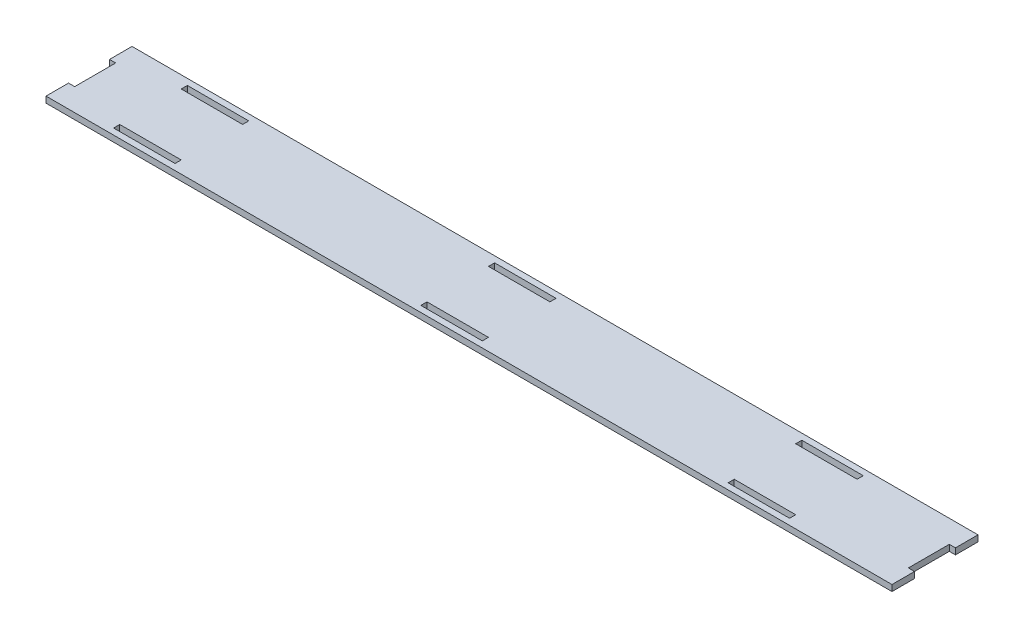
ISO-10303-21;
HEADER;
FILE_DESCRIPTION(('STEP AP214'),'2;1');
FILE_NAME('part.step','',(''),(''),'','','');
FILE_SCHEMA(('AUTOMOTIVE_DESIGN { 1 0 10303 214 1 1 1 1 }'));
ENDSEC;
DATA;
#1=APPLICATION_CONTEXT('core data for automotive mechanical design processes');
#2=APPLICATION_PROTOCOL_DEFINITION('international standard','automotive_design',2000,#1);
#3=PRODUCT_CONTEXT('',#1,'mechanical');
#4=PRODUCT('Part','Part','',(#3));
#5=PRODUCT_RELATED_PRODUCT_CATEGORY('part','',(#4));
#6=PRODUCT_DEFINITION_FORMATION('','',#4);
#7=PRODUCT_DEFINITION_CONTEXT('part definition',#1,'design');
#8=PRODUCT_DEFINITION('design','',#6,#7);
#9=PRODUCT_DEFINITION_SHAPE('','',#8);
#10=(LENGTH_UNIT() NAMED_UNIT(*) SI_UNIT(.MILLI.,.METRE.));
#11=(NAMED_UNIT(*) PLANE_ANGLE_UNIT() SI_UNIT($,.RADIAN.));
#12=(NAMED_UNIT(*) SI_UNIT($,.STERADIAN.) SOLID_ANGLE_UNIT());
#13=UNCERTAINTY_MEASURE_WITH_UNIT(LENGTH_MEASURE(1.E-05),#10,'distance_accuracy_value','');
#14=(GEOMETRIC_REPRESENTATION_CONTEXT(3) GLOBAL_UNCERTAINTY_ASSIGNED_CONTEXT((#13)) GLOBAL_UNIT_ASSIGNED_CONTEXT((#10,
#11,#12)) REPRESENTATION_CONTEXT('',''));
#15=CARTESIAN_POINT('',(0.,0.,0.));
#16=DIRECTION('',(0.,0.,1.));
#17=DIRECTION('',(1.,0.,0.));
#18=AXIS2_PLACEMENT_3D('',#15,#16,#17);
#19=CARTESIAN_POINT('',(0.,3.,0.));
#20=DIRECTION('',(0.,-1.,0.));
#21=DIRECTION('',(0.,0.,-1.));
#22=AXIS2_PLACEMENT_3D('',#19,#20,#21);
#23=PLANE('',#22);
#24=DIRECTION('',(1.,0.,0.));
#25=VECTOR('',#24,1.);
#26=CARTESIAN_POINT('',(180.,3.,-3.00000000000003));
#27=LINE('',#26,#25);
#28=CARTESIAN_POINT('',(180.,3.,-3.00000000000003));
#29=VERTEX_POINT('',#28);
#30=CARTESIAN_POINT('',(210.,3.,-3.));
#31=VERTEX_POINT('',#30);
#32=EDGE_CURVE('E302',#29,#31,#27,.T.);
#33=ORIENTED_EDGE('',*,*,#32,.F.);
#34=DIRECTION('',(0.,0.,1.));
#35=VECTOR('',#34,1.);
#36=CARTESIAN_POINT('',(180.,3.,-3.00000000000003));
#37=LINE('',#36,#35);
#38=CARTESIAN_POINT('',(180.,3.,-6.));
#39=VERTEX_POINT('',#38);
#40=EDGE_CURVE('E310',#39,#29,#37,.T.);
#41=ORIENTED_EDGE('',*,*,#40,.F.);
#42=DIRECTION('',(-1.,0.,0.));
#43=VECTOR('',#42,1.);
#44=CARTESIAN_POINT('',(180.,3.,-6.));
#45=LINE('',#44,#43);
#46=CARTESIAN_POINT('',(210.,3.,-6.00000000000001));
#47=VERTEX_POINT('',#46);
#48=EDGE_CURVE('E307',#47,#39,#45,.T.);
#49=ORIENTED_EDGE('',*,*,#48,.F.);
#50=DIRECTION('',(0.,0.,-1.));
#51=VECTOR('',#50,1.);
#52=CARTESIAN_POINT('',(210.,3.,-3.));
#53=LINE('',#52,#51);
#54=EDGE_CURVE('E304',#31,#47,#53,.T.);
#55=ORIENTED_EDGE('',*,*,#54,.F.);
#56=EDGE_LOOP('',(#33,#41,#49,#55));
#57=FACE_BOUND('',#56,.T.);
#58=DIRECTION('',(0.,0.,1.));
#59=VECTOR('',#58,1.);
#60=CARTESIAN_POINT('',(330.,3.,-39.));
#61=LINE('',#60,#59);
#62=CARTESIAN_POINT('',(330.,3.,-39.));
#63=VERTEX_POINT('',#62);
#64=CARTESIAN_POINT('',(330.,3.,-36.0000000000001));
#65=VERTEX_POINT('',#64);
#66=EDGE_CURVE('E364',#63,#65,#61,.T.);
#67=ORIENTED_EDGE('',*,*,#66,.F.);
#68=DIRECTION('',(-1.,0.,0.));
#69=VECTOR('',#68,1.);
#70=CARTESIAN_POINT('',(330.,3.,-39.));
#71=LINE('',#70,#69);
#72=CARTESIAN_POINT('',(360.,3.,-39.));
#73=VERTEX_POINT('',#72);
#74=EDGE_CURVE('E372',#73,#63,#71,.T.);
#75=ORIENTED_EDGE('',*,*,#74,.F.);
#76=DIRECTION('',(0.,0.,-1.));
#77=VECTOR('',#76,1.);
#78=CARTESIAN_POINT('',(360.,3.,-39.));
#79=LINE('',#78,#77);
#80=CARTESIAN_POINT('',(360.,3.,-36.0000000000001));
#81=VERTEX_POINT('',#80);
#82=EDGE_CURVE('E369',#81,#73,#79,.T.);
#83=ORIENTED_EDGE('',*,*,#82,.F.);
#84=DIRECTION('',(1.,0.,0.));
#85=VECTOR('',#84,1.);
#86=CARTESIAN_POINT('',(330.,3.,-36.0000000000001));
#87=LINE('',#86,#85);
#88=EDGE_CURVE('E366',#65,#81,#87,.T.);
#89=ORIENTED_EDGE('',*,*,#88,.F.);
#90=EDGE_LOOP('',(#67,#75,#83,#89));
#91=FACE_BOUND('',#90,.T.);
#92=DIRECTION('',(0.,0.,1.));
#93=VECTOR('',#92,1.);
#94=CARTESIAN_POINT('',(30.0000000000001,3.,-39.));
#95=LINE('',#94,#93);
#96=CARTESIAN_POINT('',(30.0000000000001,3.,-39.));
#97=VERTEX_POINT('',#96);
#98=CARTESIAN_POINT('',(30.0000000000001,3.,-36.));
#99=VERTEX_POINT('',#98);
#100=EDGE_CURVE('E426',#97,#99,#95,.T.);
#101=ORIENTED_EDGE('',*,*,#100,.F.);
#102=DIRECTION('',(-1.,0.,0.));
#103=VECTOR('',#102,1.);
#104=CARTESIAN_POINT('',(30.0000000000001,3.,-39.));
#105=LINE('',#104,#103);
#106=CARTESIAN_POINT('',(60.0000000000001,3.,-39.));
#107=VERTEX_POINT('',#106);
#108=EDGE_CURVE('E434',#107,#97,#105,.T.);
#109=ORIENTED_EDGE('',*,*,#108,.F.);
#110=DIRECTION('',(0.,0.,-1.));
#111=VECTOR('',#110,1.);
#112=CARTESIAN_POINT('',(60.0000000000001,3.,-39.));
#113=LINE('',#112,#111);
#114=CARTESIAN_POINT('',(60.,3.,-36.));
#115=VERTEX_POINT('',#114);
#116=EDGE_CURVE('E431',#115,#107,#113,.T.);
#117=ORIENTED_EDGE('',*,*,#116,.F.);
#118=DIRECTION('',(1.,0.,0.));
#119=VECTOR('',#118,1.);
#120=CARTESIAN_POINT('',(30.0000000000001,3.,-36.));
#121=LINE('',#120,#119);
#122=EDGE_CURVE('E428',#99,#115,#121,.T.);
#123=ORIENTED_EDGE('',*,*,#122,.F.);
#124=EDGE_LOOP('',(#101,#109,#117,#123));
#125=FACE_BOUND('',#124,.T.);
#126=DIRECTION('',(0.,0.,1.));
#127=VECTOR('',#126,1.);
#128=CARTESIAN_POINT('',(0.,3.,0.));
#129=LINE('',#128,#127);
#130=CARTESIAN_POINT('',(0.,3.,-11.));
#131=VERTEX_POINT('',#130);
#132=CARTESIAN_POINT('',(0.,3.,0.));
#133=VERTEX_POINT('',#132);
#134=EDGE_CURVE('E457',#131,#133,#129,.T.);
#135=ORIENTED_EDGE('',*,*,#134,.T.);
#136=DIRECTION('',(1.,0.,0.));
#137=VECTOR('',#136,1.);
#138=CARTESIAN_POINT('',(0.,3.,0.));
#139=LINE('',#138,#137);
#140=CARTESIAN_POINT('',(413.,3.,0.));
#141=VERTEX_POINT('',#140);
#142=EDGE_CURVE('E460',#133,#141,#139,.T.);
#143=ORIENTED_EDGE('',*,*,#142,.T.);
#144=DIRECTION('',(0.,0.,-1.));
#145=VECTOR('',#144,1.);
#146=CARTESIAN_POINT('',(413.,3.,0.));
#147=LINE('',#146,#145);
#148=CARTESIAN_POINT('',(413.,3.,-11.));
#149=VERTEX_POINT('',#148);
#150=EDGE_CURVE('E463',#141,#149,#147,.T.);
#151=ORIENTED_EDGE('',*,*,#150,.T.);
#152=DIRECTION('',(-1.,0.,0.));
#153=VECTOR('',#152,1.);
#154=CARTESIAN_POINT('',(413.,3.,-11.));
#155=LINE('',#154,#153);
#156=CARTESIAN_POINT('',(410.,3.,-11.));
#157=VERTEX_POINT('',#156);
#158=EDGE_CURVE('E465',#149,#157,#155,.T.);
#159=ORIENTED_EDGE('',*,*,#158,.T.);
#160=DIRECTION('',(0.,0.,-1.));
#161=VECTOR('',#160,1.);
#162=CARTESIAN_POINT('',(410.,3.,-31.));
#163=LINE('',#162,#161);
#164=CARTESIAN_POINT('',(410.,3.,-31.));
#165=VERTEX_POINT('',#164);
#166=EDGE_CURVE('E467',#157,#165,#163,.T.);
#167=ORIENTED_EDGE('',*,*,#166,.T.);
#168=DIRECTION('',(1.,0.,0.));
#169=VECTOR('',#168,1.);
#170=CARTESIAN_POINT('',(413.,3.,-31.));
#171=LINE('',#170,#169);
#172=CARTESIAN_POINT('',(413.,3.,-31.));
#173=VERTEX_POINT('',#172);
#174=EDGE_CURVE('E469',#165,#173,#171,.T.);
#175=ORIENTED_EDGE('',*,*,#174,.T.);
#176=DIRECTION('',(0.,0.,-1.));
#177=VECTOR('',#176,1.);
#178=CARTESIAN_POINT('',(413.,3.,-31.));
#179=LINE('',#178,#177);
#180=CARTESIAN_POINT('',(413.,3.,-42.));
#181=VERTEX_POINT('',#180);
#182=EDGE_CURVE('E471',#173,#181,#179,.T.);
#183=ORIENTED_EDGE('',*,*,#182,.T.);
#184=DIRECTION('',(-1.,0.,0.));
#185=VECTOR('',#184,1.);
#186=CARTESIAN_POINT('',(0.,3.,-42.));
#187=LINE('',#186,#185);
#188=CARTESIAN_POINT('',(0.,3.,-42.));
#189=VERTEX_POINT('',#188);
#190=EDGE_CURVE('E473',#181,#189,#187,.T.);
#191=ORIENTED_EDGE('',*,*,#190,.T.);
#192=DIRECTION('',(0.,0.,1.));
#193=VECTOR('',#192,1.);
#194=CARTESIAN_POINT('',(0.,3.,-31.));
#195=LINE('',#194,#193);
#196=CARTESIAN_POINT('',(0.,3.,-31.));
#197=VERTEX_POINT('',#196);
#198=EDGE_CURVE('E475',#189,#197,#195,.T.);
#199=ORIENTED_EDGE('',*,*,#198,.T.);
#200=DIRECTION('',(1.,0.,0.));
#201=VECTOR('',#200,1.);
#202=CARTESIAN_POINT('',(0.,3.,-31.));
#203=LINE('',#202,#201);
#204=CARTESIAN_POINT('',(3.,3.,-31.));
#205=VERTEX_POINT('',#204);
#206=EDGE_CURVE('E477',#197,#205,#203,.T.);
#207=ORIENTED_EDGE('',*,*,#206,.T.);
#208=DIRECTION('',(0.,0.,1.));
#209=VECTOR('',#208,1.);
#210=CARTESIAN_POINT('',(3.,3.,-31.));
#211=LINE('',#210,#209);
#212=CARTESIAN_POINT('',(3.,3.,-11.));
#213=VERTEX_POINT('',#212);
#214=EDGE_CURVE('E479',#205,#213,#211,.T.);
#215=ORIENTED_EDGE('',*,*,#214,.T.);
#216=DIRECTION('',(-1.,0.,0.));
#217=VECTOR('',#216,1.);
#218=CARTESIAN_POINT('',(0.,3.,-11.));
#219=LINE('',#218,#217);
#220=EDGE_CURVE('E481',#213,#131,#219,.T.);
#221=ORIENTED_EDGE('',*,*,#220,.T.);
#222=EDGE_LOOP('',(#135,#143,#151,#159,#167,#175,#183,#191,#199,#207,#215,#221));
#223=FACE_BOUND('',#222,.T.);
#224=DIRECTION('',(0.,0.,1.));
#225=VECTOR('',#224,1.);
#226=CARTESIAN_POINT('',(180.,3.,-39.));
#227=LINE('',#226,#225);
#228=CARTESIAN_POINT('',(180.,3.,-39.));
#229=VERTEX_POINT('',#228);
#230=CARTESIAN_POINT('',(180.,3.,-36.));
#231=VERTEX_POINT('',#230);
#232=EDGE_CURVE('E395',#229,#231,#227,.T.);
#233=ORIENTED_EDGE('',*,*,#232,.F.);
#234=DIRECTION('',(-1.,0.,0.));
#235=VECTOR('',#234,1.);
#236=CARTESIAN_POINT('',(180.,3.,-39.));
#237=LINE('',#236,#235);
#238=CARTESIAN_POINT('',(210.,3.,-39.));
#239=VERTEX_POINT('',#238);
#240=EDGE_CURVE('E403',#239,#229,#237,.T.);
#241=ORIENTED_EDGE('',*,*,#240,.F.);
#242=DIRECTION('',(0.,0.,-1.));
#243=VECTOR('',#242,1.);
#244=CARTESIAN_POINT('',(210.,3.,-39.));
#245=LINE('',#244,#243);
#246=CARTESIAN_POINT('',(210.,3.,-36.));
#247=VERTEX_POINT('',#246);
#248=EDGE_CURVE('E400',#247,#239,#245,.T.);
#249=ORIENTED_EDGE('',*,*,#248,.F.);
#250=DIRECTION('',(1.,0.,0.));
#251=VECTOR('',#250,1.);
#252=CARTESIAN_POINT('',(180.,3.,-36.));
#253=LINE('',#252,#251);
#254=EDGE_CURVE('E397',#231,#247,#253,.T.);
#255=ORIENTED_EDGE('',*,*,#254,.F.);
#256=EDGE_LOOP('',(#233,#241,#249,#255));
#257=FACE_BOUND('',#256,.T.);
#258=DIRECTION('',(1.,0.,0.));
#259=VECTOR('',#258,1.);
#260=CARTESIAN_POINT('',(330.,3.,-3.00000000000002));
#261=LINE('',#260,#259);
#262=CARTESIAN_POINT('',(330.,3.,-3.00000000000002));
#263=VERTEX_POINT('',#262);
#264=CARTESIAN_POINT('',(360.,3.,-3.00000000000002));
#265=VERTEX_POINT('',#264);
#266=EDGE_CURVE('E333',#263,#265,#261,.T.);
#267=ORIENTED_EDGE('',*,*,#266,.F.);
#268=DIRECTION('',(0.,0.,1.));
#269=VECTOR('',#268,1.);
#270=CARTESIAN_POINT('',(330.,3.,-3.00000000000002));
#271=LINE('',#270,#269);
#272=CARTESIAN_POINT('',(330.,3.,-5.99999999999993));
#273=VERTEX_POINT('',#272);
#274=EDGE_CURVE('E341',#273,#263,#271,.T.);
#275=ORIENTED_EDGE('',*,*,#274,.F.);
#276=DIRECTION('',(-1.,0.,0.));
#277=VECTOR('',#276,1.);
#278=CARTESIAN_POINT('',(330.,3.,-5.99999999999993));
#279=LINE('',#278,#277);
#280=CARTESIAN_POINT('',(360.,3.,-5.99999999999992));
#281=VERTEX_POINT('',#280);
#282=EDGE_CURVE('E338',#281,#273,#279,.T.);
#283=ORIENTED_EDGE('',*,*,#282,.F.);
#284=DIRECTION('',(0.,0.,-1.));
#285=VECTOR('',#284,1.);
#286=CARTESIAN_POINT('',(360.,3.,-3.00000000000002));
#287=LINE('',#286,#285);
#288=EDGE_CURVE('E335',#265,#281,#287,.T.);
#289=ORIENTED_EDGE('',*,*,#288,.F.);
#290=EDGE_LOOP('',(#267,#275,#283,#289));
#291=FACE_BOUND('',#290,.T.);
#292=DIRECTION('',(1.,0.,0.));
#293=VECTOR('',#292,1.);
#294=CARTESIAN_POINT('',(30.0000000000001,3.,-3.00000000000002));
#295=LINE('',#294,#293);
#296=CARTESIAN_POINT('',(30.0000000000001,3.,-3.00000000000002));
#297=VERTEX_POINT('',#296);
#298=CARTESIAN_POINT('',(60.0000000000001,3.,-3.00000000000002));
#299=VERTEX_POINT('',#298);
#300=EDGE_CURVE('E266',#297,#299,#295,.T.);
#301=ORIENTED_EDGE('',*,*,#300,.F.);
#302=DIRECTION('',(0.,0.,1.));
#303=VECTOR('',#302,1.);
#304=CARTESIAN_POINT('',(30.0000000000001,3.,-3.00000000000002));
#305=LINE('',#304,#303);
#306=CARTESIAN_POINT('',(30.0000000000001,3.,-6.00000000000004));
#307=VERTEX_POINT('',#306);
#308=EDGE_CURVE('E288',#307,#297,#305,.T.);
#309=ORIENTED_EDGE('',*,*,#308,.F.);
#310=DIRECTION('',(-1.,0.,0.));
#311=VECTOR('',#310,1.);
#312=CARTESIAN_POINT('',(30.0000000000001,3.,-6.00000000000004));
#313=LINE('',#312,#311);
#314=CARTESIAN_POINT('',(60.,3.,-6.00000000000003));
#315=VERTEX_POINT('',#314);
#316=EDGE_CURVE('E286',#315,#307,#313,.T.);
#317=ORIENTED_EDGE('',*,*,#316,.F.);
#318=DIRECTION('',(0.,0.,-1.));
#319=VECTOR('',#318,1.);
#320=CARTESIAN_POINT('',(60.0000000000001,3.,-3.00000000000002));
#321=LINE('',#320,#319);
#322=EDGE_CURVE('E274',#299,#315,#321,.T.);
#323=ORIENTED_EDGE('',*,*,#322,.F.);
#324=EDGE_LOOP('',(#301,#309,#317,#323));
#325=FACE_BOUND('',#324,.T.);
#326=ADVANCED_FACE('F33',(#57,#91,#125,#223,#257,#291,#325),#23,.F.);
#327=CARTESIAN_POINT('',(0.,0.,0.));
#328=DIRECTION('',(0.,-1.,0.));
#329=DIRECTION('',(0.,0.,-1.));
#330=AXIS2_PLACEMENT_3D('',#327,#328,#329);
#331=PLANE('',#330);
#332=DIRECTION('',(0.,0.,1.));
#333=VECTOR('',#332,1.);
#334=CARTESIAN_POINT('',(0.,0.,0.));
#335=LINE('',#334,#333);
#336=CARTESIAN_POINT('',(0.,0.,-11.));
#337=VERTEX_POINT('',#336);
#338=CARTESIAN_POINT('',(0.,0.,0.));
#339=VERTEX_POINT('',#338);
#340=EDGE_CURVE('E456',#337,#339,#335,.T.);
#341=ORIENTED_EDGE('',*,*,#340,.F.);
#342=DIRECTION('',(-1.,0.,0.));
#343=VECTOR('',#342,1.);
#344=CARTESIAN_POINT('',(0.,0.,-11.));
#345=LINE('',#344,#343);
#346=CARTESIAN_POINT('',(3.,0.,-11.));
#347=VERTEX_POINT('',#346);
#348=EDGE_CURVE('E461',#347,#337,#345,.T.);
#349=ORIENTED_EDGE('',*,*,#348,.F.);
#350=DIRECTION('',(0.,0.,1.));
#351=VECTOR('',#350,1.);
#352=CARTESIAN_POINT('',(3.,0.,-31.));
#353=LINE('',#352,#351);
#354=CARTESIAN_POINT('',(3.,0.,-31.));
#355=VERTEX_POINT('',#354);
#356=EDGE_CURVE('E504',#355,#347,#353,.T.);
#357=ORIENTED_EDGE('',*,*,#356,.F.);
#358=DIRECTION('',(1.,0.,0.));
#359=VECTOR('',#358,1.);
#360=CARTESIAN_POINT('',(0.,0.,-31.));
#361=LINE('',#360,#359);
#362=CARTESIAN_POINT('',(0.,0.,-31.));
#363=VERTEX_POINT('',#362);
#364=EDGE_CURVE('E502',#363,#355,#361,.T.);
#365=ORIENTED_EDGE('',*,*,#364,.F.);
#366=DIRECTION('',(0.,0.,1.));
#367=VECTOR('',#366,1.);
#368=CARTESIAN_POINT('',(0.,0.,-31.));
#369=LINE('',#368,#367);
#370=CARTESIAN_POINT('',(0.,0.,-42.));
#371=VERTEX_POINT('',#370);
#372=EDGE_CURVE('E500',#371,#363,#369,.T.);
#373=ORIENTED_EDGE('',*,*,#372,.F.);
#374=DIRECTION('',(-1.,0.,0.));
#375=VECTOR('',#374,1.);
#376=CARTESIAN_POINT('',(0.,0.,-42.));
#377=LINE('',#376,#375);
#378=CARTESIAN_POINT('',(413.,0.,-42.));
#379=VERTEX_POINT('',#378);
#380=EDGE_CURVE('E498',#379,#371,#377,.T.);
#381=ORIENTED_EDGE('',*,*,#380,.F.);
#382=DIRECTION('',(0.,0.,-1.));
#383=VECTOR('',#382,1.);
#384=CARTESIAN_POINT('',(413.,0.,-31.));
#385=LINE('',#384,#383);
#386=CARTESIAN_POINT('',(413.,0.,-31.));
#387=VERTEX_POINT('',#386);
#388=EDGE_CURVE('E496',#387,#379,#385,.T.);
#389=ORIENTED_EDGE('',*,*,#388,.F.);
#390=DIRECTION('',(1.,0.,0.));
#391=VECTOR('',#390,1.);
#392=CARTESIAN_POINT('',(413.,0.,-31.));
#393=LINE('',#392,#391);
#394=CARTESIAN_POINT('',(410.,0.,-31.));
#395=VERTEX_POINT('',#394);
#396=EDGE_CURVE('E494',#395,#387,#393,.T.);
#397=ORIENTED_EDGE('',*,*,#396,.F.);
#398=DIRECTION('',(0.,0.,-1.));
#399=VECTOR('',#398,1.);
#400=CARTESIAN_POINT('',(410.,0.,-31.));
#401=LINE('',#400,#399);
#402=CARTESIAN_POINT('',(410.,0.,-11.));
#403=VERTEX_POINT('',#402);
#404=EDGE_CURVE('E492',#403,#395,#401,.T.);
#405=ORIENTED_EDGE('',*,*,#404,.F.);
#406=DIRECTION('',(-1.,0.,0.));
#407=VECTOR('',#406,1.);
#408=CARTESIAN_POINT('',(413.,0.,-11.));
#409=LINE('',#408,#407);
#410=CARTESIAN_POINT('',(413.,0.,-11.));
#411=VERTEX_POINT('',#410);
#412=EDGE_CURVE('E490',#411,#403,#409,.T.);
#413=ORIENTED_EDGE('',*,*,#412,.F.);
#414=DIRECTION('',(0.,0.,-1.));
#415=VECTOR('',#414,1.);
#416=CARTESIAN_POINT('',(413.,0.,0.));
#417=LINE('',#416,#415);
#418=CARTESIAN_POINT('',(413.,0.,0.));
#419=VERTEX_POINT('',#418);
#420=EDGE_CURVE('E488',#419,#411,#417,.T.);
#421=ORIENTED_EDGE('',*,*,#420,.F.);
#422=DIRECTION('',(1.,0.,0.));
#423=VECTOR('',#422,1.);
#424=CARTESIAN_POINT('',(0.,0.,0.));
#425=LINE('',#424,#423);
#426=EDGE_CURVE('E486',#339,#419,#425,.T.);
#427=ORIENTED_EDGE('',*,*,#426,.F.);
#428=EDGE_LOOP('',(#341,#349,#357,#365,#373,#381,#389,#397,#405,#413,#421,#427));
#429=FACE_BOUND('',#428,.T.);
#430=DIRECTION('',(-1.,0.,0.));
#431=VECTOR('',#430,1.);
#432=CARTESIAN_POINT('',(30.0000000000001,0.,-39.));
#433=LINE('',#432,#431);
#434=CARTESIAN_POINT('',(60.0000000000001,0.,-39.));
#435=VERTEX_POINT('',#434);
#436=CARTESIAN_POINT('',(30.0000000000001,0.,-39.));
#437=VERTEX_POINT('',#436);
#438=EDGE_CURVE('E429',#435,#437,#433,.T.);
#439=ORIENTED_EDGE('',*,*,#438,.T.);
#440=DIRECTION('',(0.,0.,1.));
#441=VECTOR('',#440,1.);
#442=CARTESIAN_POINT('',(30.0000000000001,0.,-39.));
#443=LINE('',#442,#441);
#444=CARTESIAN_POINT('',(30.0000000000001,0.,-36.));
#445=VERTEX_POINT('',#444);
#446=EDGE_CURVE('E425',#437,#445,#443,.T.);
#447=ORIENTED_EDGE('',*,*,#446,.T.);
#448=DIRECTION('',(1.,0.,0.));
#449=VECTOR('',#448,1.);
#450=CARTESIAN_POINT('',(30.0000000000001,0.,-36.));
#451=LINE('',#450,#449);
#452=CARTESIAN_POINT('',(60.,0.,-36.));
#453=VERTEX_POINT('',#452);
#454=EDGE_CURVE('E439',#445,#453,#451,.T.);
#455=ORIENTED_EDGE('',*,*,#454,.T.);
#456=DIRECTION('',(0.,0.,-1.));
#457=VECTOR('',#456,1.);
#458=CARTESIAN_POINT('',(60.0000000000001,0.,-39.));
#459=LINE('',#458,#457);
#460=EDGE_CURVE('E442',#453,#435,#459,.T.);
#461=ORIENTED_EDGE('',*,*,#460,.T.);
#462=EDGE_LOOP('',(#439,#447,#455,#461));
#463=FACE_BOUND('',#462,.T.);
#464=DIRECTION('',(-1.,0.,0.));
#465=VECTOR('',#464,1.);
#466=CARTESIAN_POINT('',(180.,0.,-39.));
#467=LINE('',#466,#465);
#468=CARTESIAN_POINT('',(210.,0.,-39.));
#469=VERTEX_POINT('',#468);
#470=CARTESIAN_POINT('',(180.,0.,-39.));
#471=VERTEX_POINT('',#470);
#472=EDGE_CURVE('E398',#469,#471,#467,.T.);
#473=ORIENTED_EDGE('',*,*,#472,.T.);
#474=DIRECTION('',(0.,0.,1.));
#475=VECTOR('',#474,1.);
#476=CARTESIAN_POINT('',(180.,0.,-39.));
#477=LINE('',#476,#475);
#478=CARTESIAN_POINT('',(180.,0.,-36.));
#479=VERTEX_POINT('',#478);
#480=EDGE_CURVE('E394',#471,#479,#477,.T.);
#481=ORIENTED_EDGE('',*,*,#480,.T.);
#482=DIRECTION('',(1.,0.,0.));
#483=VECTOR('',#482,1.);
#484=CARTESIAN_POINT('',(180.,0.,-36.));
#485=LINE('',#484,#483);
#486=CARTESIAN_POINT('',(210.,0.,-36.));
#487=VERTEX_POINT('',#486);
#488=EDGE_CURVE('E408',#479,#487,#485,.T.);
#489=ORIENTED_EDGE('',*,*,#488,.T.);
#490=DIRECTION('',(0.,0.,-1.));
#491=VECTOR('',#490,1.);
#492=CARTESIAN_POINT('',(210.,0.,-39.));
#493=LINE('',#492,#491);
#494=EDGE_CURVE('E411',#487,#469,#493,.T.);
#495=ORIENTED_EDGE('',*,*,#494,.T.);
#496=EDGE_LOOP('',(#473,#481,#489,#495));
#497=FACE_BOUND('',#496,.T.);
#498=DIRECTION('',(-1.,0.,0.));
#499=VECTOR('',#498,1.);
#500=CARTESIAN_POINT('',(330.,0.,-39.));
#501=LINE('',#500,#499);
#502=CARTESIAN_POINT('',(360.,0.,-39.));
#503=VERTEX_POINT('',#502);
#504=CARTESIAN_POINT('',(330.,0.,-39.));
#505=VERTEX_POINT('',#504);
#506=EDGE_CURVE('E367',#503,#505,#501,.T.);
#507=ORIENTED_EDGE('',*,*,#506,.T.);
#508=DIRECTION('',(0.,0.,1.));
#509=VECTOR('',#508,1.);
#510=CARTESIAN_POINT('',(330.,0.,-39.));
#511=LINE('',#510,#509);
#512=CARTESIAN_POINT('',(330.,0.,-36.0000000000001));
#513=VERTEX_POINT('',#512);
#514=EDGE_CURVE('E363',#505,#513,#511,.T.);
#515=ORIENTED_EDGE('',*,*,#514,.T.);
#516=DIRECTION('',(1.,0.,0.));
#517=VECTOR('',#516,1.);
#518=CARTESIAN_POINT('',(330.,0.,-36.0000000000001));
#519=LINE('',#518,#517);
#520=CARTESIAN_POINT('',(360.,0.,-36.0000000000001));
#521=VERTEX_POINT('',#520);
#522=EDGE_CURVE('E377',#513,#521,#519,.T.);
#523=ORIENTED_EDGE('',*,*,#522,.T.);
#524=DIRECTION('',(0.,0.,-1.));
#525=VECTOR('',#524,1.);
#526=CARTESIAN_POINT('',(360.,0.,-39.));
#527=LINE('',#526,#525);
#528=EDGE_CURVE('E380',#521,#503,#527,.T.);
#529=ORIENTED_EDGE('',*,*,#528,.T.);
#530=EDGE_LOOP('',(#507,#515,#523,#529));
#531=FACE_BOUND('',#530,.T.);
#532=DIRECTION('',(0.,0.,1.));
#533=VECTOR('',#532,1.);
#534=CARTESIAN_POINT('',(330.,0.,-3.00000000000002));
#535=LINE('',#534,#533);
#536=CARTESIAN_POINT('',(330.,0.,-5.99999999999993));
#537=VERTEX_POINT('',#536);
#538=CARTESIAN_POINT('',(330.,0.,-3.00000000000002));
#539=VERTEX_POINT('',#538);
#540=EDGE_CURVE('E336',#537,#539,#535,.T.);
#541=ORIENTED_EDGE('',*,*,#540,.T.);
#542=DIRECTION('',(1.,0.,0.));
#543=VECTOR('',#542,1.);
#544=CARTESIAN_POINT('',(330.,0.,-3.00000000000002));
#545=LINE('',#544,#543);
#546=CARTESIAN_POINT('',(360.,0.,-3.00000000000002));
#547=VERTEX_POINT('',#546);
#548=EDGE_CURVE('E332',#539,#547,#545,.T.);
#549=ORIENTED_EDGE('',*,*,#548,.T.);
#550=DIRECTION('',(0.,0.,-1.));
#551=VECTOR('',#550,1.);
#552=CARTESIAN_POINT('',(360.,0.,-3.00000000000002));
#553=LINE('',#552,#551);
#554=CARTESIAN_POINT('',(360.,0.,-5.99999999999992));
#555=VERTEX_POINT('',#554);
#556=EDGE_CURVE('E346',#547,#555,#553,.T.);
#557=ORIENTED_EDGE('',*,*,#556,.T.);
#558=DIRECTION('',(-1.,0.,0.));
#559=VECTOR('',#558,1.);
#560=CARTESIAN_POINT('',(330.,0.,-5.99999999999993));
#561=LINE('',#560,#559);
#562=EDGE_CURVE('E349',#555,#537,#561,.T.);
#563=ORIENTED_EDGE('',*,*,#562,.T.);
#564=EDGE_LOOP('',(#541,#549,#557,#563));
#565=FACE_BOUND('',#564,.T.);
#566=DIRECTION('',(0.,0.,1.));
#567=VECTOR('',#566,1.);
#568=CARTESIAN_POINT('',(180.,0.,-3.00000000000003));
#569=LINE('',#568,#567);
#570=CARTESIAN_POINT('',(180.,0.,-6.));
#571=VERTEX_POINT('',#570);
#572=CARTESIAN_POINT('',(180.,0.,-3.00000000000003));
#573=VERTEX_POINT('',#572);
#574=EDGE_CURVE('E305',#571,#573,#569,.T.);
#575=ORIENTED_EDGE('',*,*,#574,.T.);
#576=DIRECTION('',(1.,0.,0.));
#577=VECTOR('',#576,1.);
#578=CARTESIAN_POINT('',(180.,0.,-3.00000000000003));
#579=LINE('',#578,#577);
#580=CARTESIAN_POINT('',(210.,0.,-3.));
#581=VERTEX_POINT('',#580);
#582=EDGE_CURVE('E282',#573,#581,#579,.T.);
#583=ORIENTED_EDGE('',*,*,#582,.T.);
#584=DIRECTION('',(0.,0.,-1.));
#585=VECTOR('',#584,1.);
#586=CARTESIAN_POINT('',(210.,0.,-3.));
#587=LINE('',#586,#585);
#588=CARTESIAN_POINT('',(210.,0.,-6.00000000000001));
#589=VERTEX_POINT('',#588);
#590=EDGE_CURVE('E315',#581,#589,#587,.T.);
#591=ORIENTED_EDGE('',*,*,#590,.T.);
#592=DIRECTION('',(-1.,0.,0.));
#593=VECTOR('',#592,1.);
#594=CARTESIAN_POINT('',(180.,0.,-6.));
#595=LINE('',#594,#593);
#596=EDGE_CURVE('E318',#589,#571,#595,.T.);
#597=ORIENTED_EDGE('',*,*,#596,.T.);
#598=EDGE_LOOP('',(#575,#583,#591,#597));
#599=FACE_BOUND('',#598,.T.);
#600=DIRECTION('',(0.,0.,1.));
#601=VECTOR('',#600,1.);
#602=CARTESIAN_POINT('',(30.0000000000001,0.,-3.00000000000002));
#603=LINE('',#602,#601);
#604=CARTESIAN_POINT('',(30.0000000000001,0.,-6.00000000000004));
#605=VERTEX_POINT('',#604);
#606=CARTESIAN_POINT('',(30.0000000000001,0.,-3.00000000000002));
#607=VERTEX_POINT('',#606);
#608=EDGE_CURVE('E275',#605,#607,#603,.T.);
#609=ORIENTED_EDGE('',*,*,#608,.T.);
#610=DIRECTION('',(1.,0.,0.));
#611=VECTOR('',#610,1.);
#612=CARTESIAN_POINT('',(30.0000000000001,0.,-3.00000000000002));
#613=LINE('',#612,#611);
#614=CARTESIAN_POINT('',(60.0000000000001,0.,-3.00000000000002));
#615=VERTEX_POINT('',#614);
#616=EDGE_CURVE('E56',#607,#615,#613,.T.);
#617=ORIENTED_EDGE('',*,*,#616,.T.);
#618=DIRECTION('',(0.,0.,-1.));
#619=VECTOR('',#618,1.);
#620=CARTESIAN_POINT('',(60.0000000000001,0.,-3.00000000000002));
#621=LINE('',#620,#619);
#622=CARTESIAN_POINT('',(60.,0.,-6.00000000000003));
#623=VERTEX_POINT('',#622);
#624=EDGE_CURVE('E281',#615,#623,#621,.T.);
#625=ORIENTED_EDGE('',*,*,#624,.T.);
#626=DIRECTION('',(-1.,0.,0.));
#627=VECTOR('',#626,1.);
#628=CARTESIAN_POINT('',(30.0000000000001,0.,-6.00000000000004));
#629=LINE('',#628,#627);
#630=EDGE_CURVE('E294',#623,#605,#629,.T.);
#631=ORIENTED_EDGE('',*,*,#630,.T.);
#632=EDGE_LOOP('',(#609,#617,#625,#631));
#633=FACE_BOUND('',#632,.T.);
#634=ADVANCED_FACE('F546',(#429,#463,#497,#531,#565,#599,#633),#331,.T.);
#635=CARTESIAN_POINT('',(0.,3.,0.));
#636=DIRECTION('',(1.,0.,0.));
#637=DIRECTION('',(0.,0.,-1.));
#638=AXIS2_PLACEMENT_3D('',#635,#636,#637);
#639=PLANE('',#638);
#640=ORIENTED_EDGE('',*,*,#340,.T.);
#641=DIRECTION('',(0.,-1.,0.));
#642=VECTOR('',#641,1.);
#643=CARTESIAN_POINT('',(0.,3.,0.));
#644=LINE('',#643,#642);
#645=EDGE_CURVE('E11',#133,#339,#644,.T.);
#646=ORIENTED_EDGE('',*,*,#645,.F.);
#647=ORIENTED_EDGE('',*,*,#134,.F.);
#648=DIRECTION('',(0.,-1.,0.));
#649=VECTOR('',#648,1.);
#650=CARTESIAN_POINT('',(0.,3.,-11.));
#651=LINE('',#650,#649);
#652=EDGE_CURVE('E483',#131,#337,#651,.T.);
#653=ORIENTED_EDGE('',*,*,#652,.T.);
#654=EDGE_LOOP('',(#640,#646,#647,#653));
#655=FACE_BOUND('',#654,.T.);
#656=ADVANCED_FACE('F35',(#655),#639,.F.);
#657=CARTESIAN_POINT('',(0.,3.,0.));
#658=DIRECTION('',(0.,0.,-1.));
#659=DIRECTION('',(-1.,0.,0.));
#660=AXIS2_PLACEMENT_3D('',#657,#658,#659);
#661=PLANE('',#660);
#662=ORIENTED_EDGE('',*,*,#426,.T.);
#663=DIRECTION('',(0.,-1.,0.));
#664=VECTOR('',#663,1.);
#665=CARTESIAN_POINT('',(413.,3.,0.));
#666=LINE('',#665,#664);
#667=EDGE_CURVE('E41',#141,#419,#666,.T.);
#668=ORIENTED_EDGE('',*,*,#667,.F.);
#669=ORIENTED_EDGE('',*,*,#142,.F.);
#670=ORIENTED_EDGE('',*,*,#645,.T.);
#671=EDGE_LOOP('',(#662,#668,#669,#670));
#672=FACE_BOUND('',#671,.T.);
#673=ADVANCED_FACE('F564',(#672),#661,.F.);
#674=CARTESIAN_POINT('',(413.,3.,0.));
#675=DIRECTION('',(-1.,0.,0.));
#676=DIRECTION('',(0.,0.,1.));
#677=AXIS2_PLACEMENT_3D('',#674,#675,#676);
#678=PLANE('',#677);
#679=ORIENTED_EDGE('',*,*,#420,.T.);
#680=DIRECTION('',(0.,-1.,0.));
#681=VECTOR('',#680,1.);
#682=CARTESIAN_POINT('',(413.,3.,-11.));
#683=LINE('',#682,#681);
#684=EDGE_CURVE('E533',#149,#411,#683,.T.);
#685=ORIENTED_EDGE('',*,*,#684,.F.);
#686=ORIENTED_EDGE('',*,*,#150,.F.);
#687=ORIENTED_EDGE('',*,*,#667,.T.);
#688=EDGE_LOOP('',(#679,#685,#686,#687));
#689=FACE_BOUND('',#688,.T.);
#690=ADVANCED_FACE('F540',(#689),#678,.F.);
#691=CARTESIAN_POINT('',(413.,3.,-11.));
#692=DIRECTION('',(0.,0.,1.));
#693=DIRECTION('',(1.,0.,0.));
#694=AXIS2_PLACEMENT_3D('',#691,#692,#693);
#695=PLANE('',#694);
#696=ORIENTED_EDGE('',*,*,#412,.T.);
#697=DIRECTION('',(0.,-1.,0.));
#698=VECTOR('',#697,1.);
#699=CARTESIAN_POINT('',(410.,3.,-11.));
#700=LINE('',#699,#698);
#701=EDGE_CURVE('E530',#157,#403,#700,.T.);
#702=ORIENTED_EDGE('',*,*,#701,.F.);
#703=ORIENTED_EDGE('',*,*,#158,.F.);
#704=ORIENTED_EDGE('',*,*,#684,.T.);
#705=EDGE_LOOP('',(#696,#702,#703,#704));
#706=FACE_BOUND('',#705,.T.);
#707=ADVANCED_FACE('F552',(#706),#695,.F.);
#708=CARTESIAN_POINT('',(410.,3.,-31.));
#709=DIRECTION('',(-1.,0.,0.));
#710=DIRECTION('',(0.,0.,1.));
#711=AXIS2_PLACEMENT_3D('',#708,#709,#710);
#712=PLANE('',#711);
#713=ORIENTED_EDGE('',*,*,#404,.T.);
#714=DIRECTION('',(0.,-1.,0.));
#715=VECTOR('',#714,1.);
#716=CARTESIAN_POINT('',(410.,3.,-31.));
#717=LINE('',#716,#715);
#718=EDGE_CURVE('E527',#165,#395,#717,.T.);
#719=ORIENTED_EDGE('',*,*,#718,.F.);
#720=ORIENTED_EDGE('',*,*,#166,.F.);
#721=ORIENTED_EDGE('',*,*,#701,.T.);
#722=EDGE_LOOP('',(#713,#719,#720,#721));
#723=FACE_BOUND('',#722,.T.);
#724=ADVANCED_FACE('F556',(#723),#712,.F.);
#725=CARTESIAN_POINT('',(413.,3.,-31.));
#726=DIRECTION('',(0.,0.,-1.));
#727=DIRECTION('',(-1.,0.,0.));
#728=AXIS2_PLACEMENT_3D('',#725,#726,#727);
#729=PLANE('',#728);
#730=ORIENTED_EDGE('',*,*,#396,.T.);
#731=DIRECTION('',(0.,-1.,0.));
#732=VECTOR('',#731,1.);
#733=CARTESIAN_POINT('',(413.,3.,-31.));
#734=LINE('',#733,#732);
#735=EDGE_CURVE('E524',#173,#387,#734,.T.);
#736=ORIENTED_EDGE('',*,*,#735,.F.);
#737=ORIENTED_EDGE('',*,*,#174,.F.);
#738=ORIENTED_EDGE('',*,*,#718,.T.);
#739=EDGE_LOOP('',(#730,#736,#737,#738));
#740=FACE_BOUND('',#739,.T.);
#741=ADVANCED_FACE('F597',(#740),#729,.F.);
#742=CARTESIAN_POINT('',(413.,3.,-31.));
#743=DIRECTION('',(-1.,0.,0.));
#744=DIRECTION('',(0.,0.,1.));
#745=AXIS2_PLACEMENT_3D('',#742,#743,#744);
#746=PLANE('',#745);
#747=ORIENTED_EDGE('',*,*,#388,.T.);
#748=DIRECTION('',(0.,-1.,0.));
#749=VECTOR('',#748,1.);
#750=CARTESIAN_POINT('',(413.,3.,-42.));
#751=LINE('',#750,#749);
#752=EDGE_CURVE('E521',#181,#379,#751,.T.);
#753=ORIENTED_EDGE('',*,*,#752,.F.);
#754=ORIENTED_EDGE('',*,*,#182,.F.);
#755=ORIENTED_EDGE('',*,*,#735,.T.);
#756=EDGE_LOOP('',(#747,#753,#754,#755));
#757=FACE_BOUND('',#756,.T.);
#758=ADVANCED_FACE('F595',(#757),#746,.F.);
#759=CARTESIAN_POINT('',(0.,3.,-42.));
#760=DIRECTION('',(0.,0.,1.));
#761=DIRECTION('',(1.,0.,0.));
#762=AXIS2_PLACEMENT_3D('',#759,#760,#761);
#763=PLANE('',#762);
#764=ORIENTED_EDGE('',*,*,#380,.T.);
#765=DIRECTION('',(0.,-1.,0.));
#766=VECTOR('',#765,1.);
#767=CARTESIAN_POINT('',(0.,3.,-42.));
#768=LINE('',#767,#766);
#769=EDGE_CURVE('E518',#189,#371,#768,.T.);
#770=ORIENTED_EDGE('',*,*,#769,.F.);
#771=ORIENTED_EDGE('',*,*,#190,.F.);
#772=ORIENTED_EDGE('',*,*,#752,.T.);
#773=EDGE_LOOP('',(#764,#770,#771,#772));
#774=FACE_BOUND('',#773,.T.);
#775=ADVANCED_FACE('F591',(#774),#763,.F.);
#776=CARTESIAN_POINT('',(0.,3.,-31.));
#777=DIRECTION('',(1.,0.,0.));
#778=DIRECTION('',(0.,0.,-1.));
#779=AXIS2_PLACEMENT_3D('',#776,#777,#778);
#780=PLANE('',#779);
#781=ORIENTED_EDGE('',*,*,#372,.T.);
#782=DIRECTION('',(0.,-1.,0.));
#783=VECTOR('',#782,1.);
#784=CARTESIAN_POINT('',(0.,3.,-31.));
#785=LINE('',#784,#783);
#786=EDGE_CURVE('E515',#197,#363,#785,.T.);
#787=ORIENTED_EDGE('',*,*,#786,.F.);
#788=ORIENTED_EDGE('',*,*,#198,.F.);
#789=ORIENTED_EDGE('',*,*,#769,.T.);
#790=EDGE_LOOP('',(#781,#787,#788,#789));
#791=FACE_BOUND('',#790,.T.);
#792=ADVANCED_FACE('F586',(#791),#780,.F.);
#793=CARTESIAN_POINT('',(0.,3.,-31.));
#794=DIRECTION('',(0.,0.,-1.));
#795=DIRECTION('',(-1.,0.,0.));
#796=AXIS2_PLACEMENT_3D('',#793,#794,#795);
#797=PLANE('',#796);
#798=ORIENTED_EDGE('',*,*,#364,.T.);
#799=DIRECTION('',(0.,-1.,0.));
#800=VECTOR('',#799,1.);
#801=CARTESIAN_POINT('',(3.,3.,-31.));
#802=LINE('',#801,#800);
#803=EDGE_CURVE('E512',#205,#355,#802,.T.);
#804=ORIENTED_EDGE('',*,*,#803,.F.);
#805=ORIENTED_EDGE('',*,*,#206,.F.);
#806=ORIENTED_EDGE('',*,*,#786,.T.);
#807=EDGE_LOOP('',(#798,#804,#805,#806));
#808=FACE_BOUND('',#807,.T.);
#809=ADVANCED_FACE('F580',(#808),#797,.F.);
#810=CARTESIAN_POINT('',(3.,3.,-31.));
#811=DIRECTION('',(1.,0.,0.));
#812=DIRECTION('',(0.,0.,-1.));
#813=AXIS2_PLACEMENT_3D('',#810,#811,#812);
#814=PLANE('',#813);
#815=ORIENTED_EDGE('',*,*,#356,.T.);
#816=DIRECTION('',(0.,-1.,0.));
#817=VECTOR('',#816,1.);
#818=CARTESIAN_POINT('',(3.,3.,-11.));
#819=LINE('',#818,#817);
#820=EDGE_CURVE('E509',#213,#347,#819,.T.);
#821=ORIENTED_EDGE('',*,*,#820,.F.);
#822=ORIENTED_EDGE('',*,*,#214,.F.);
#823=ORIENTED_EDGE('',*,*,#803,.T.);
#824=EDGE_LOOP('',(#815,#821,#822,#823));
#825=FACE_BOUND('',#824,.T.);
#826=ADVANCED_FACE('F576',(#825),#814,.F.);
#827=CARTESIAN_POINT('',(0.,3.,-11.));
#828=DIRECTION('',(0.,0.,1.));
#829=DIRECTION('',(1.,0.,0.));
#830=AXIS2_PLACEMENT_3D('',#827,#828,#829);
#831=PLANE('',#830);
#832=ORIENTED_EDGE('',*,*,#348,.T.);
#833=ORIENTED_EDGE('',*,*,#652,.F.);
#834=ORIENTED_EDGE('',*,*,#220,.F.);
#835=ORIENTED_EDGE('',*,*,#820,.T.);
#836=EDGE_LOOP('',(#832,#833,#834,#835));
#837=FACE_BOUND('',#836,.T.);
#838=ADVANCED_FACE('F571',(#837),#831,.F.);
#839=CARTESIAN_POINT('',(30.0000000000001,3.,-39.));
#840=DIRECTION('',(1.,0.,0.));
#841=DIRECTION('',(0.,0.,-1.));
#842=AXIS2_PLACEMENT_3D('',#839,#840,#841);
#843=PLANE('',#842);
#844=ORIENTED_EDGE('',*,*,#446,.F.);
#845=DIRECTION('',(0.,-1.,0.));
#846=VECTOR('',#845,1.);
#847=CARTESIAN_POINT('',(30.0000000000001,3.,-39.));
#848=LINE('',#847,#846);
#849=EDGE_CURVE('E436',#97,#437,#848,.T.);
#850=ORIENTED_EDGE('',*,*,#849,.F.);
#851=ORIENTED_EDGE('',*,*,#100,.T.);
#852=DIRECTION('',(0.,-1.,0.));
#853=VECTOR('',#852,1.);
#854=CARTESIAN_POINT('',(30.0000000000001,3.,-36.));
#855=LINE('',#854,#853);
#856=EDGE_CURVE('E453',#99,#445,#855,.T.);
#857=ORIENTED_EDGE('',*,*,#856,.T.);
#858=EDGE_LOOP('',(#844,#850,#851,#857));
#859=FACE_BOUND('',#858,.T.);
#860=ADVANCED_FACE('F616',(#859),#843,.T.);
#861=CARTESIAN_POINT('',(30.0000000000001,3.,-36.));
#862=DIRECTION('',(0.,0.,-1.));
#863=DIRECTION('',(-1.,0.,0.));
#864=AXIS2_PLACEMENT_3D('',#861,#862,#863);
#865=PLANE('',#864);
#866=ORIENTED_EDGE('',*,*,#454,.F.);
#867=ORIENTED_EDGE('',*,*,#856,.F.);
#868=ORIENTED_EDGE('',*,*,#122,.T.);
#869=DIRECTION('',(0.,-1.,0.));
#870=VECTOR('',#869,1.);
#871=CARTESIAN_POINT('',(60.,3.,-36.));
#872=LINE('',#871,#870);
#873=EDGE_CURVE('E451',#115,#453,#872,.T.);
#874=ORIENTED_EDGE('',*,*,#873,.T.);
#875=EDGE_LOOP('',(#866,#867,#868,#874));
#876=FACE_BOUND('',#875,.T.);
#877=ADVANCED_FACE('F654',(#876),#865,.T.);
#878=CARTESIAN_POINT('',(60.0000000000001,3.,-39.));
#879=DIRECTION('',(-1.,0.,0.));
#880=DIRECTION('',(0.,0.,1.));
#881=AXIS2_PLACEMENT_3D('',#878,#879,#880);
#882=PLANE('',#881);
#883=ORIENTED_EDGE('',*,*,#460,.F.);
#884=ORIENTED_EDGE('',*,*,#873,.F.);
#885=ORIENTED_EDGE('',*,*,#116,.T.);
#886=DIRECTION('',(0.,-1.,0.));
#887=VECTOR('',#886,1.);
#888=CARTESIAN_POINT('',(60.0000000000001,3.,-39.));
#889=LINE('',#888,#887);
#890=EDGE_CURVE('E449',#107,#435,#889,.T.);
#891=ORIENTED_EDGE('',*,*,#890,.T.);
#892=EDGE_LOOP('',(#883,#884,#885,#891));
#893=FACE_BOUND('',#892,.T.);
#894=ADVANCED_FACE('F661',(#893),#882,.T.);
#895=CARTESIAN_POINT('',(30.0000000000001,3.,-39.));
#896=DIRECTION('',(0.,0.,1.));
#897=DIRECTION('',(1.,0.,0.));
#898=AXIS2_PLACEMENT_3D('',#895,#896,#897);
#899=PLANE('',#898);
#900=ORIENTED_EDGE('',*,*,#438,.F.);
#901=ORIENTED_EDGE('',*,*,#890,.F.);
#902=ORIENTED_EDGE('',*,*,#108,.T.);
#903=ORIENTED_EDGE('',*,*,#849,.T.);
#904=EDGE_LOOP('',(#900,#901,#902,#903));
#905=FACE_BOUND('',#904,.T.);
#906=ADVANCED_FACE('F668',(#905),#899,.T.);
#907=CARTESIAN_POINT('',(180.,3.,-39.));
#908=DIRECTION('',(1.,0.,0.));
#909=DIRECTION('',(0.,0.,-1.));
#910=AXIS2_PLACEMENT_3D('',#907,#908,#909);
#911=PLANE('',#910);
#912=ORIENTED_EDGE('',*,*,#480,.F.);
#913=DIRECTION('',(0.,-1.,0.));
#914=VECTOR('',#913,1.);
#915=CARTESIAN_POINT('',(180.,3.,-39.));
#916=LINE('',#915,#914);
#917=EDGE_CURVE('E405',#229,#471,#916,.T.);
#918=ORIENTED_EDGE('',*,*,#917,.F.);
#919=ORIENTED_EDGE('',*,*,#232,.T.);
#920=DIRECTION('',(0.,-1.,0.));
#921=VECTOR('',#920,1.);
#922=CARTESIAN_POINT('',(180.,3.,-36.));
#923=LINE('',#922,#921);
#924=EDGE_CURVE('E422',#231,#479,#923,.T.);
#925=ORIENTED_EDGE('',*,*,#924,.T.);
#926=EDGE_LOOP('',(#912,#918,#919,#925));
#927=FACE_BOUND('',#926,.T.);
#928=ADVANCED_FACE('F676',(#927),#911,.T.);
#929=CARTESIAN_POINT('',(180.,3.,-36.));
#930=DIRECTION('',(0.,0.,-1.));
#931=DIRECTION('',(-1.,0.,0.));
#932=AXIS2_PLACEMENT_3D('',#929,#930,#931);
#933=PLANE('',#932);
#934=ORIENTED_EDGE('',*,*,#488,.F.);
#935=ORIENTED_EDGE('',*,*,#924,.F.);
#936=ORIENTED_EDGE('',*,*,#254,.T.);
#937=DIRECTION('',(0.,-1.,0.));
#938=VECTOR('',#937,1.);
#939=CARTESIAN_POINT('',(210.,3.,-36.));
#940=LINE('',#939,#938);
#941=EDGE_CURVE('E420',#247,#487,#940,.T.);
#942=ORIENTED_EDGE('',*,*,#941,.T.);
#943=EDGE_LOOP('',(#934,#935,#936,#942));
#944=FACE_BOUND('',#943,.T.);
#945=ADVANCED_FACE('F684',(#944),#933,.T.);
#946=CARTESIAN_POINT('',(210.,3.,-39.));
#947=DIRECTION('',(-1.,0.,0.));
#948=DIRECTION('',(0.,0.,1.));
#949=AXIS2_PLACEMENT_3D('',#946,#947,#948);
#950=PLANE('',#949);
#951=ORIENTED_EDGE('',*,*,#494,.F.);
#952=ORIENTED_EDGE('',*,*,#941,.F.);
#953=ORIENTED_EDGE('',*,*,#248,.T.);
#954=DIRECTION('',(0.,-1.,0.));
#955=VECTOR('',#954,1.);
#956=CARTESIAN_POINT('',(210.,3.,-39.));
#957=LINE('',#956,#955);
#958=EDGE_CURVE('E418',#239,#469,#957,.T.);
#959=ORIENTED_EDGE('',*,*,#958,.T.);
#960=EDGE_LOOP('',(#951,#952,#953,#959));
#961=FACE_BOUND('',#960,.T.);
#962=ADVANCED_FACE('F692',(#961),#950,.T.);
#963=CARTESIAN_POINT('',(180.,3.,-39.));
#964=DIRECTION('',(0.,0.,1.));
#965=DIRECTION('',(1.,0.,0.));
#966=AXIS2_PLACEMENT_3D('',#963,#964,#965);
#967=PLANE('',#966);
#968=ORIENTED_EDGE('',*,*,#472,.F.);
#969=ORIENTED_EDGE('',*,*,#958,.F.);
#970=ORIENTED_EDGE('',*,*,#240,.T.);
#971=ORIENTED_EDGE('',*,*,#917,.T.);
#972=EDGE_LOOP('',(#968,#969,#970,#971));
#973=FACE_BOUND('',#972,.T.);
#974=ADVANCED_FACE('F700',(#973),#967,.T.);
#975=CARTESIAN_POINT('',(330.,3.,-39.));
#976=DIRECTION('',(1.,0.,0.));
#977=DIRECTION('',(0.,0.,-1.));
#978=AXIS2_PLACEMENT_3D('',#975,#976,#977);
#979=PLANE('',#978);
#980=ORIENTED_EDGE('',*,*,#514,.F.);
#981=DIRECTION('',(0.,-1.,0.));
#982=VECTOR('',#981,1.);
#983=CARTESIAN_POINT('',(330.,3.,-39.));
#984=LINE('',#983,#982);
#985=EDGE_CURVE('E374',#63,#505,#984,.T.);
#986=ORIENTED_EDGE('',*,*,#985,.F.);
#987=ORIENTED_EDGE('',*,*,#66,.T.);
#988=DIRECTION('',(0.,-1.,0.));
#989=VECTOR('',#988,1.);
#990=CARTESIAN_POINT('',(330.,3.,-36.0000000000001));
#991=LINE('',#990,#989);
#992=EDGE_CURVE('E391',#65,#513,#991,.T.);
#993=ORIENTED_EDGE('',*,*,#992,.T.);
#994=EDGE_LOOP('',(#980,#986,#987,#993));
#995=FACE_BOUND('',#994,.T.);
#996=ADVANCED_FACE('F708',(#995),#979,.T.);
#997=CARTESIAN_POINT('',(330.,3.,-36.0000000000001));
#998=DIRECTION('',(0.,0.,-1.));
#999=DIRECTION('',(-1.,0.,0.));
#1000=AXIS2_PLACEMENT_3D('',#997,#998,#999);
#1001=PLANE('',#1000);
#1002=ORIENTED_EDGE('',*,*,#522,.F.);
#1003=ORIENTED_EDGE('',*,*,#992,.F.);
#1004=ORIENTED_EDGE('',*,*,#88,.T.);
#1005=DIRECTION('',(0.,-1.,0.));
#1006=VECTOR('',#1005,1.);
#1007=CARTESIAN_POINT('',(360.,3.,-36.0000000000001));
#1008=LINE('',#1007,#1006);
#1009=EDGE_CURVE('E389',#81,#521,#1008,.T.);
#1010=ORIENTED_EDGE('',*,*,#1009,.T.);
#1011=EDGE_LOOP('',(#1002,#1003,#1004,#1010));
#1012=FACE_BOUND('',#1011,.T.);
#1013=ADVANCED_FACE('F716',(#1012),#1001,.T.);
#1014=CARTESIAN_POINT('',(360.,3.,-39.));
#1015=DIRECTION('',(-1.,0.,0.));
#1016=DIRECTION('',(0.,0.,1.));
#1017=AXIS2_PLACEMENT_3D('',#1014,#1015,#1016);
#1018=PLANE('',#1017);
#1019=ORIENTED_EDGE('',*,*,#528,.F.);
#1020=ORIENTED_EDGE('',*,*,#1009,.F.);
#1021=ORIENTED_EDGE('',*,*,#82,.T.);
#1022=DIRECTION('',(0.,-1.,0.));
#1023=VECTOR('',#1022,1.);
#1024=CARTESIAN_POINT('',(360.,3.,-39.));
#1025=LINE('',#1024,#1023);
#1026=EDGE_CURVE('E387',#73,#503,#1025,.T.);
#1027=ORIENTED_EDGE('',*,*,#1026,.T.);
#1028=EDGE_LOOP('',(#1019,#1020,#1021,#1027));
#1029=FACE_BOUND('',#1028,.T.);
#1030=ADVANCED_FACE('F724',(#1029),#1018,.T.);
#1031=CARTESIAN_POINT('',(330.,3.,-39.));
#1032=DIRECTION('',(0.,0.,1.));
#1033=DIRECTION('',(1.,0.,0.));
#1034=AXIS2_PLACEMENT_3D('',#1031,#1032,#1033);
#1035=PLANE('',#1034);
#1036=ORIENTED_EDGE('',*,*,#506,.F.);
#1037=ORIENTED_EDGE('',*,*,#1026,.F.);
#1038=ORIENTED_EDGE('',*,*,#74,.T.);
#1039=ORIENTED_EDGE('',*,*,#985,.T.);
#1040=EDGE_LOOP('',(#1036,#1037,#1038,#1039));
#1041=FACE_BOUND('',#1040,.T.);
#1042=ADVANCED_FACE('F732',(#1041),#1035,.T.);
#1043=CARTESIAN_POINT('',(330.,3.,-3.00000000000002));
#1044=DIRECTION('',(0.,0.,-1.));
#1045=DIRECTION('',(-1.,0.,0.));
#1046=AXIS2_PLACEMENT_3D('',#1043,#1044,#1045);
#1047=PLANE('',#1046);
#1048=ORIENTED_EDGE('',*,*,#548,.F.);
#1049=DIRECTION('',(0.,-1.,0.));
#1050=VECTOR('',#1049,1.);
#1051=CARTESIAN_POINT('',(330.,3.,-3.00000000000002));
#1052=LINE('',#1051,#1050);
#1053=EDGE_CURVE('E343',#263,#539,#1052,.T.);
#1054=ORIENTED_EDGE('',*,*,#1053,.F.);
#1055=ORIENTED_EDGE('',*,*,#266,.T.);
#1056=DIRECTION('',(0.,-1.,0.));
#1057=VECTOR('',#1056,1.);
#1058=CARTESIAN_POINT('',(360.,3.,-3.00000000000002));
#1059=LINE('',#1058,#1057);
#1060=EDGE_CURVE('E360',#265,#547,#1059,.T.);
#1061=ORIENTED_EDGE('',*,*,#1060,.T.);
#1062=EDGE_LOOP('',(#1048,#1054,#1055,#1061));
#1063=FACE_BOUND('',#1062,.T.);
#1064=ADVANCED_FACE('F740',(#1063),#1047,.T.);
#1065=CARTESIAN_POINT('',(360.,3.,-3.00000000000002));
#1066=DIRECTION('',(-1.,0.,0.));
#1067=DIRECTION('',(0.,0.,1.));
#1068=AXIS2_PLACEMENT_3D('',#1065,#1066,#1067);
#1069=PLANE('',#1068);
#1070=ORIENTED_EDGE('',*,*,#556,.F.);
#1071=ORIENTED_EDGE('',*,*,#1060,.F.);
#1072=ORIENTED_EDGE('',*,*,#288,.T.);
#1073=DIRECTION('',(0.,-1.,0.));
#1074=VECTOR('',#1073,1.);
#1075=CARTESIAN_POINT('',(360.,3.,-5.99999999999992));
#1076=LINE('',#1075,#1074);
#1077=EDGE_CURVE('E358',#281,#555,#1076,.T.);
#1078=ORIENTED_EDGE('',*,*,#1077,.T.);
#1079=EDGE_LOOP('',(#1070,#1071,#1072,#1078));
#1080=FACE_BOUND('',#1079,.T.);
#1081=ADVANCED_FACE('F748',(#1080),#1069,.T.);
#1082=CARTESIAN_POINT('',(330.,3.,-5.99999999999993));
#1083=DIRECTION('',(0.,0.,1.));
#1084=DIRECTION('',(1.,0.,0.));
#1085=AXIS2_PLACEMENT_3D('',#1082,#1083,#1084);
#1086=PLANE('',#1085);
#1087=ORIENTED_EDGE('',*,*,#562,.F.);
#1088=ORIENTED_EDGE('',*,*,#1077,.F.);
#1089=ORIENTED_EDGE('',*,*,#282,.T.);
#1090=DIRECTION('',(0.,-1.,0.));
#1091=VECTOR('',#1090,1.);
#1092=CARTESIAN_POINT('',(330.,3.,-5.99999999999993));
#1093=LINE('',#1092,#1091);
#1094=EDGE_CURVE('E356',#273,#537,#1093,.T.);
#1095=ORIENTED_EDGE('',*,*,#1094,.T.);
#1096=EDGE_LOOP('',(#1087,#1088,#1089,#1095));
#1097=FACE_BOUND('',#1096,.T.);
#1098=ADVANCED_FACE('F756',(#1097),#1086,.T.);
#1099=CARTESIAN_POINT('',(330.,3.,-3.00000000000002));
#1100=DIRECTION('',(1.,0.,0.));
#1101=DIRECTION('',(0.,0.,-1.));
#1102=AXIS2_PLACEMENT_3D('',#1099,#1100,#1101);
#1103=PLANE('',#1102);
#1104=ORIENTED_EDGE('',*,*,#540,.F.);
#1105=ORIENTED_EDGE('',*,*,#1094,.F.);
#1106=ORIENTED_EDGE('',*,*,#274,.T.);
#1107=ORIENTED_EDGE('',*,*,#1053,.T.);
#1108=EDGE_LOOP('',(#1104,#1105,#1106,#1107));
#1109=FACE_BOUND('',#1108,.T.);
#1110=ADVANCED_FACE('F764',(#1109),#1103,.T.);
#1111=CARTESIAN_POINT('',(180.,3.,-3.00000000000003));
#1112=DIRECTION('',(0.,0.,-1.));
#1113=DIRECTION('',(-1.,0.,0.));
#1114=AXIS2_PLACEMENT_3D('',#1111,#1112,#1113);
#1115=PLANE('',#1114);
#1116=ORIENTED_EDGE('',*,*,#582,.F.);
#1117=DIRECTION('',(0.,-1.,0.));
#1118=VECTOR('',#1117,1.);
#1119=CARTESIAN_POINT('',(180.,3.,-3.00000000000003));
#1120=LINE('',#1119,#1118);
#1121=EDGE_CURVE('E312',#29,#573,#1120,.T.);
#1122=ORIENTED_EDGE('',*,*,#1121,.F.);
#1123=ORIENTED_EDGE('',*,*,#32,.T.);
#1124=DIRECTION('',(0.,-1.,0.));
#1125=VECTOR('',#1124,1.);
#1126=CARTESIAN_POINT('',(210.,3.,-3.));
#1127=LINE('',#1126,#1125);
#1128=EDGE_CURVE('E329',#31,#581,#1127,.T.);
#1129=ORIENTED_EDGE('',*,*,#1128,.T.);
#1130=EDGE_LOOP('',(#1116,#1122,#1123,#1129));
#1131=FACE_BOUND('',#1130,.T.);
#1132=ADVANCED_FACE('F772',(#1131),#1115,.T.);
#1133=CARTESIAN_POINT('',(210.,3.,-3.));
#1134=DIRECTION('',(-1.,0.,0.));
#1135=DIRECTION('',(0.,0.,1.));
#1136=AXIS2_PLACEMENT_3D('',#1133,#1134,#1135);
#1137=PLANE('',#1136);
#1138=ORIENTED_EDGE('',*,*,#590,.F.);
#1139=ORIENTED_EDGE('',*,*,#1128,.F.);
#1140=ORIENTED_EDGE('',*,*,#54,.T.);
#1141=DIRECTION('',(0.,-1.,0.));
#1142=VECTOR('',#1141,1.);
#1143=CARTESIAN_POINT('',(210.,3.,-6.00000000000001));
#1144=LINE('',#1143,#1142);
#1145=EDGE_CURVE('E327',#47,#589,#1144,.T.);
#1146=ORIENTED_EDGE('',*,*,#1145,.T.);
#1147=EDGE_LOOP('',(#1138,#1139,#1140,#1146));
#1148=FACE_BOUND('',#1147,.T.);
#1149=ADVANCED_FACE('F780',(#1148),#1137,.T.);
#1150=CARTESIAN_POINT('',(180.,3.,-6.));
#1151=DIRECTION('',(0.,0.,1.));
#1152=DIRECTION('',(1.,0.,0.));
#1153=AXIS2_PLACEMENT_3D('',#1150,#1151,#1152);
#1154=PLANE('',#1153);
#1155=ORIENTED_EDGE('',*,*,#596,.F.);
#1156=ORIENTED_EDGE('',*,*,#1145,.F.);
#1157=ORIENTED_EDGE('',*,*,#48,.T.);
#1158=DIRECTION('',(0.,-1.,0.));
#1159=VECTOR('',#1158,1.);
#1160=CARTESIAN_POINT('',(180.,3.,-6.));
#1161=LINE('',#1160,#1159);
#1162=EDGE_CURVE('E325',#39,#571,#1161,.T.);
#1163=ORIENTED_EDGE('',*,*,#1162,.T.);
#1164=EDGE_LOOP('',(#1155,#1156,#1157,#1163));
#1165=FACE_BOUND('',#1164,.T.);
#1166=ADVANCED_FACE('F788',(#1165),#1154,.T.);
#1167=CARTESIAN_POINT('',(180.,3.,-3.00000000000003));
#1168=DIRECTION('',(1.,0.,0.));
#1169=DIRECTION('',(0.,0.,-1.));
#1170=AXIS2_PLACEMENT_3D('',#1167,#1168,#1169);
#1171=PLANE('',#1170);
#1172=ORIENTED_EDGE('',*,*,#574,.F.);
#1173=ORIENTED_EDGE('',*,*,#1162,.F.);
#1174=ORIENTED_EDGE('',*,*,#40,.T.);
#1175=ORIENTED_EDGE('',*,*,#1121,.T.);
#1176=EDGE_LOOP('',(#1172,#1173,#1174,#1175));
#1177=FACE_BOUND('',#1176,.T.);
#1178=ADVANCED_FACE('F796',(#1177),#1171,.T.);
#1179=CARTESIAN_POINT('',(30.0000000000001,3.,-3.00000000000002));
#1180=DIRECTION('',(0.,0.,-1.));
#1181=DIRECTION('',(-1.,0.,0.));
#1182=AXIS2_PLACEMENT_3D('',#1179,#1180,#1181);
#1183=PLANE('',#1182);
#1184=ORIENTED_EDGE('',*,*,#616,.F.);
#1185=DIRECTION('',(0.,-1.,0.));
#1186=VECTOR('',#1185,1.);
#1187=CARTESIAN_POINT('',(30.0000000000001,3.,-3.00000000000002));
#1188=LINE('',#1187,#1186);
#1189=EDGE_CURVE('E270',#297,#607,#1188,.T.);
#1190=ORIENTED_EDGE('',*,*,#1189,.F.);
#1191=ORIENTED_EDGE('',*,*,#300,.T.);
#1192=DIRECTION('',(0.,-1.,0.));
#1193=VECTOR('',#1192,1.);
#1194=CARTESIAN_POINT('',(60.0000000000001,3.,-3.00000000000002));
#1195=LINE('',#1194,#1193);
#1196=EDGE_CURVE('E269',#299,#615,#1195,.T.);
#1197=ORIENTED_EDGE('',*,*,#1196,.T.);
#1198=EDGE_LOOP('',(#1184,#1190,#1191,#1197));
#1199=FACE_BOUND('',#1198,.T.);
#1200=ADVANCED_FACE('F268',(#1199),#1183,.T.);
#1201=CARTESIAN_POINT('',(60.0000000000001,3.,-3.00000000000002));
#1202=DIRECTION('',(-1.,0.,0.));
#1203=DIRECTION('',(0.,0.,1.));
#1204=AXIS2_PLACEMENT_3D('',#1201,#1202,#1203);
#1205=PLANE('',#1204);
#1206=ORIENTED_EDGE('',*,*,#624,.F.);
#1207=ORIENTED_EDGE('',*,*,#1196,.F.);
#1208=ORIENTED_EDGE('',*,*,#322,.T.);
#1209=DIRECTION('',(0.,-1.,0.));
#1210=VECTOR('',#1209,1.);
#1211=CARTESIAN_POINT('',(60.,3.,-6.00000000000003));
#1212=LINE('',#1211,#1210);
#1213=EDGE_CURVE('E283',#315,#623,#1212,.T.);
#1214=ORIENTED_EDGE('',*,*,#1213,.T.);
#1215=EDGE_LOOP('',(#1206,#1207,#1208,#1214));
#1216=FACE_BOUND('',#1215,.T.);
#1217=ADVANCED_FACE('F278',(#1216),#1205,.T.);
#1218=CARTESIAN_POINT('',(30.0000000000001,3.,-6.00000000000004));
#1219=DIRECTION('',(0.,0.,1.));
#1220=DIRECTION('',(1.,0.,0.));
#1221=AXIS2_PLACEMENT_3D('',#1218,#1219,#1220);
#1222=PLANE('',#1221);
#1223=ORIENTED_EDGE('',*,*,#630,.F.);
#1224=ORIENTED_EDGE('',*,*,#1213,.F.);
#1225=ORIENTED_EDGE('',*,*,#316,.T.);
#1226=DIRECTION('',(0.,-1.,0.));
#1227=VECTOR('',#1226,1.);
#1228=CARTESIAN_POINT('',(30.0000000000001,3.,-6.00000000000004));
#1229=LINE('',#1228,#1227);
#1230=EDGE_CURVE('E48',#307,#605,#1229,.T.);
#1231=ORIENTED_EDGE('',*,*,#1230,.T.);
#1232=EDGE_LOOP('',(#1223,#1224,#1225,#1231));
#1233=FACE_BOUND('',#1232,.T.);
#1234=ADVANCED_FACE('F817',(#1233),#1222,.T.);
#1235=CARTESIAN_POINT('',(30.0000000000001,3.,-3.00000000000002));
#1236=DIRECTION('',(1.,0.,0.));
#1237=DIRECTION('',(0.,0.,-1.));
#1238=AXIS2_PLACEMENT_3D('',#1235,#1236,#1237);
#1239=PLANE('',#1238);
#1240=ORIENTED_EDGE('',*,*,#608,.F.);
#1241=ORIENTED_EDGE('',*,*,#1230,.F.);
#1242=ORIENTED_EDGE('',*,*,#308,.T.);
#1243=ORIENTED_EDGE('',*,*,#1189,.T.);
#1244=EDGE_LOOP('',(#1240,#1241,#1242,#1243));
#1245=FACE_BOUND('',#1244,.T.);
#1246=ADVANCED_FACE('F824',(#1245),#1239,.T.);
#1247=CLOSED_SHELL('',(#326,#634,#656,#673,#690,#707,#724,#741,#758,#775,#792,#809,#826,#838,
#860,#877,#894,#906,#928,#945,#962,#974,#996,#1013,#1030,#1042,#1064,#1081,#1098,#1110,#1132,
#1149,#1166,#1178,#1200,#1217,#1234,#1246));
#1248=MANIFOLD_SOLID_BREP('B2',#1247);
#1249=ADVANCED_BREP_SHAPE_REPRESENTATION('',(#18,#1248),#14);
#1250=SHAPE_DEFINITION_REPRESENTATION(#9,#1249);
ENDSEC;
END-ISO-10303-21;
